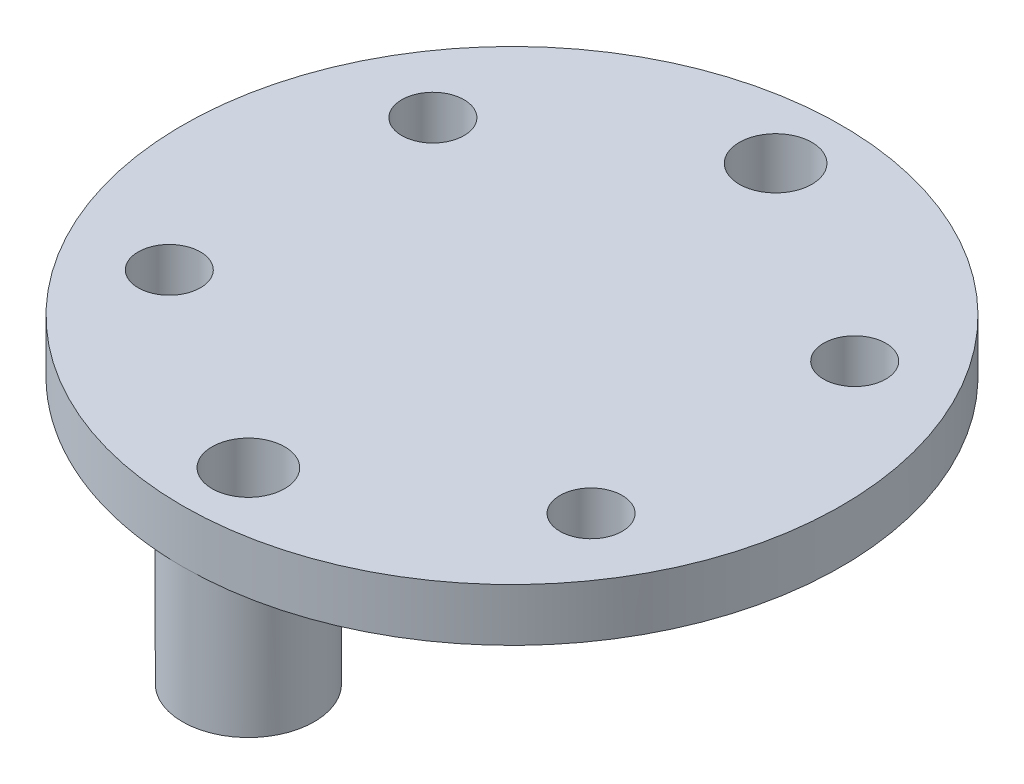
ISO-10303-21;
HEADER;
FILE_DESCRIPTION(('STEP AP214'),'2;1');
FILE_NAME('part.step','',(''),(''),'','','');
FILE_SCHEMA(('AUTOMOTIVE_DESIGN { 1 0 10303 214 1 1 1 1 }'));
ENDSEC;
DATA;
#1=APPLICATION_CONTEXT('core data for automotive mechanical design processes');
#2=APPLICATION_PROTOCOL_DEFINITION('international standard','automotive_design',2000,#1);
#3=PRODUCT_CONTEXT('',#1,'mechanical');
#4=PRODUCT('Part','Part','',(#3));
#5=PRODUCT_RELATED_PRODUCT_CATEGORY('part','',(#4));
#6=PRODUCT_DEFINITION_FORMATION('','',#4);
#7=PRODUCT_DEFINITION_CONTEXT('part definition',#1,'design');
#8=PRODUCT_DEFINITION('design','',#6,#7);
#9=PRODUCT_DEFINITION_SHAPE('','',#8);
#10=(LENGTH_UNIT() NAMED_UNIT(*) SI_UNIT(.MILLI.,.METRE.));
#11=(NAMED_UNIT(*) PLANE_ANGLE_UNIT() SI_UNIT($,.RADIAN.));
#12=(NAMED_UNIT(*) SI_UNIT($,.STERADIAN.) SOLID_ANGLE_UNIT());
#13=UNCERTAINTY_MEASURE_WITH_UNIT(LENGTH_MEASURE(1.E-05),#10,'distance_accuracy_value','');
#14=(GEOMETRIC_REPRESENTATION_CONTEXT(3) GLOBAL_UNCERTAINTY_ASSIGNED_CONTEXT((#13)) GLOBAL_UNIT_ASSIGNED_CONTEXT((#10,
#11,#12)) REPRESENTATION_CONTEXT('',''));
#15=CARTESIAN_POINT('',(0.,0.,0.));
#16=DIRECTION('',(0.,0.,1.));
#17=DIRECTION('',(1.,0.,0.));
#18=AXIS2_PLACEMENT_3D('',#15,#16,#17);
#19=CARTESIAN_POINT('',(0.,2.54,-12.7));
#20=DIRECTION('',(0.,-1.,0.));
#21=DIRECTION('',(0.,0.,-1.));
#22=AXIS2_PLACEMENT_3D('',#19,#20,#21);
#23=CYLINDRICAL_SURFACE('',#22,1.75);
#24=CARTESIAN_POINT('',(0.,2.54,-12.7));
#25=DIRECTION('',(0.,1.,0.));
#26=DIRECTION('',(0.,0.,1.));
#27=AXIS2_PLACEMENT_3D('',#24,#25,#26);
#28=CIRCLE('',#27,1.75);
#29=CARTESIAN_POINT('',(0.,2.54,-10.95));
#30=VERTEX_POINT('',#29);
#31=EDGE_CURVE('E55',#30,#30,#28,.T.);
#32=ORIENTED_EDGE('',*,*,#31,.T.);
#33=EDGE_LOOP('',(#32));
#34=FACE_BOUND('',#33,.T.);
#35=CARTESIAN_POINT('',(0.,-6.47499999892,-12.7));
#36=DIRECTION('',(0.,1.,0.));
#37=DIRECTION('',(0.,0.,1.));
#38=AXIS2_PLACEMENT_3D('',#35,#36,#37);
#39=CIRCLE('',#38,1.75);
#40=CARTESIAN_POINT('',(0.,-6.47499999892,-10.95));
#41=VERTEX_POINT('',#40);
#42=EDGE_CURVE('E179',#41,#41,#39,.T.);
#43=ORIENTED_EDGE('',*,*,#42,.F.);
#44=EDGE_LOOP('',(#43));
#45=FACE_BOUND('',#44,.T.);
#46=ADVANCED_FACE('F43',(#34,#45),#23,.F.);
#47=CARTESIAN_POINT('',(-10.16,2.54,6.35));
#48=DIRECTION('',(0.,-1.,0.));
#49=DIRECTION('',(0.,0.,-1.));
#50=AXIS2_PLACEMENT_3D('',#47,#48,#49);
#51=CYLINDRICAL_SURFACE('',#50,1.5);
#52=CARTESIAN_POINT('',(-10.16,2.54,6.35));
#53=DIRECTION('',(0.,1.,0.));
#54=DIRECTION('',(0.,0.,1.));
#55=AXIS2_PLACEMENT_3D('',#52,#53,#54);
#56=CIRCLE('',#55,1.5);
#57=CARTESIAN_POINT('',(-10.16,2.54,7.85));
#58=VERTEX_POINT('',#57);
#59=EDGE_CURVE('E87',#58,#58,#56,.F.);
#60=ORIENTED_EDGE('',*,*,#59,.F.);
#61=EDGE_LOOP('',(#60));
#62=FACE_BOUND('',#61,.T.);
#63=CARTESIAN_POINT('',(-10.16,0.,6.35));
#64=DIRECTION('',(0.,1.,0.));
#65=DIRECTION('',(0.,0.,1.));
#66=AXIS2_PLACEMENT_3D('',#63,#64,#65);
#67=CIRCLE('',#66,1.5);
#68=CARTESIAN_POINT('',(-10.16,0.,7.85));
#69=VERTEX_POINT('',#68);
#70=EDGE_CURVE('E50',#69,#69,#67,.F.);
#71=ORIENTED_EDGE('',*,*,#70,.T.);
#72=EDGE_LOOP('',(#71));
#73=FACE_BOUND('',#72,.T.);
#74=ADVANCED_FACE('F107',(#62,#73),#51,.F.);
#75=CARTESIAN_POINT('',(10.16,2.54,6.35));
#76=DIRECTION('',(0.,-1.,0.));
#77=DIRECTION('',(0.,0.,-1.));
#78=AXIS2_PLACEMENT_3D('',#75,#76,#77);
#79=CYLINDRICAL_SURFACE('',#78,1.5);
#80=CARTESIAN_POINT('',(10.16,2.54,6.35));
#81=DIRECTION('',(0.,1.,0.));
#82=DIRECTION('',(0.,0.,1.));
#83=AXIS2_PLACEMENT_3D('',#80,#81,#82);
#84=CIRCLE('',#83,1.5);
#85=CARTESIAN_POINT('',(10.16,2.54,7.85));
#86=VERTEX_POINT('',#85);
#87=EDGE_CURVE('E83',#86,#86,#84,.T.);
#88=ORIENTED_EDGE('',*,*,#87,.T.);
#89=EDGE_LOOP('',(#88));
#90=FACE_BOUND('',#89,.T.);
#91=CARTESIAN_POINT('',(10.16,0.,6.35));
#92=DIRECTION('',(0.,1.,0.));
#93=DIRECTION('',(0.,0.,1.));
#94=AXIS2_PLACEMENT_3D('',#91,#92,#93);
#95=CIRCLE('',#94,1.5);
#96=CARTESIAN_POINT('',(10.16,0.,7.85));
#97=VERTEX_POINT('',#96);
#98=EDGE_CURVE('E101',#97,#97,#95,.T.);
#99=ORIENTED_EDGE('',*,*,#98,.F.);
#100=EDGE_LOOP('',(#99));
#101=FACE_BOUND('',#100,.T.);
#102=ADVANCED_FACE('F131',(#90,#101),#79,.F.);
#103=CARTESIAN_POINT('',(-10.16,2.54,-6.35));
#104=DIRECTION('',(0.,-1.,0.));
#105=DIRECTION('',(0.,0.,-1.));
#106=AXIS2_PLACEMENT_3D('',#103,#104,#105);
#107=CYLINDRICAL_SURFACE('',#106,1.5);
#108=CARTESIAN_POINT('',(-10.16,2.54,-6.35));
#109=DIRECTION('',(0.,1.,0.));
#110=DIRECTION('',(0.,0.,1.));
#111=AXIS2_PLACEMENT_3D('',#108,#109,#110);
#112=CIRCLE('',#111,1.5);
#113=CARTESIAN_POINT('',(-10.16,2.54,-4.85));
#114=VERTEX_POINT('',#113);
#115=EDGE_CURVE('E81',#114,#114,#112,.T.);
#116=ORIENTED_EDGE('',*,*,#115,.T.);
#117=EDGE_LOOP('',(#116));
#118=FACE_BOUND('',#117,.T.);
#119=CARTESIAN_POINT('',(-10.16,0.,-6.35));
#120=DIRECTION('',(0.,1.,0.));
#121=DIRECTION('',(0.,0.,1.));
#122=AXIS2_PLACEMENT_3D('',#119,#120,#121);
#123=CIRCLE('',#122,1.5);
#124=CARTESIAN_POINT('',(-10.16,0.,-4.85));
#125=VERTEX_POINT('',#124);
#126=EDGE_CURVE('E97',#125,#125,#123,.T.);
#127=ORIENTED_EDGE('',*,*,#126,.F.);
#128=EDGE_LOOP('',(#127));
#129=FACE_BOUND('',#128,.T.);
#130=ADVANCED_FACE('F143',(#118,#129),#107,.F.);
#131=CARTESIAN_POINT('',(10.16,2.54,-6.35));
#132=DIRECTION('',(0.,-1.,0.));
#133=DIRECTION('',(0.,0.,-1.));
#134=AXIS2_PLACEMENT_3D('',#131,#132,#133);
#135=CYLINDRICAL_SURFACE('',#134,1.5);
#136=CARTESIAN_POINT('',(10.16,2.54,-6.35));
#137=DIRECTION('',(0.,1.,0.));
#138=DIRECTION('',(0.,0.,1.));
#139=AXIS2_PLACEMENT_3D('',#136,#137,#138);
#140=CIRCLE('',#139,1.5);
#141=CARTESIAN_POINT('',(10.16,2.54,-4.85));
#142=VERTEX_POINT('',#141);
#143=EDGE_CURVE('E79',#142,#142,#140,.F.);
#144=ORIENTED_EDGE('',*,*,#143,.F.);
#145=EDGE_LOOP('',(#144));
#146=FACE_BOUND('',#145,.T.);
#147=CARTESIAN_POINT('',(10.16,0.,-6.35));
#148=DIRECTION('',(0.,1.,0.));
#149=DIRECTION('',(0.,0.,1.));
#150=AXIS2_PLACEMENT_3D('',#147,#148,#149);
#151=CIRCLE('',#150,1.5);
#152=CARTESIAN_POINT('',(10.16,0.,-4.85));
#153=VERTEX_POINT('',#152);
#154=EDGE_CURVE('E92',#153,#153,#151,.F.);
#155=ORIENTED_EDGE('',*,*,#154,.T.);
#156=EDGE_LOOP('',(#155));
#157=FACE_BOUND('',#156,.T.);
#158=ADVANCED_FACE('F145',(#146,#157),#135,.F.);
#159=CARTESIAN_POINT('',(0.,2.54,0.));
#160=DIRECTION('',(0.,-1.,0.));
#161=DIRECTION('',(0.,0.,-1.));
#162=AXIS2_PLACEMENT_3D('',#159,#160,#161);
#163=CYLINDRICAL_SURFACE('',#162,15.875);
#164=CARTESIAN_POINT('',(0.,2.54,0.));
#165=DIRECTION('',(0.,1.,0.));
#166=DIRECTION('',(0.,0.,1.));
#167=AXIS2_PLACEMENT_3D('',#164,#165,#166);
#168=CIRCLE('',#167,15.875);
#169=CARTESIAN_POINT('',(0.,2.54,15.875));
#170=VERTEX_POINT('',#169);
#171=EDGE_CURVE('E73',#170,#170,#168,.T.);
#172=ORIENTED_EDGE('',*,*,#171,.F.);
#173=EDGE_LOOP('',(#172));
#174=FACE_BOUND('',#173,.T.);
#175=CARTESIAN_POINT('',(0.,0.,0.));
#176=DIRECTION('',(0.,1.,0.));
#177=DIRECTION('',(0.,0.,1.));
#178=AXIS2_PLACEMENT_3D('',#175,#176,#177);
#179=CIRCLE('',#178,15.875);
#180=CARTESIAN_POINT('',(0.,0.,15.875));
#181=VERTEX_POINT('',#180);
#182=CARTESIAN_POINT('',(0.,0.,-15.875));
#183=VERTEX_POINT('',#182);
#184=EDGE_CURVE('E95',#181,#183,#179,.T.);
#185=ORIENTED_EDGE('',*,*,#184,.T.);
#186=EDGE_CURVE('E96',#183,#181,#179,.T.);
#187=ORIENTED_EDGE('',*,*,#186,.T.);
#188=EDGE_LOOP('',(#185,#187));
#189=FACE_BOUND('',#188,.T.);
#190=ADVANCED_FACE('F44',(#174,#189),#163,.T.);
#191=CARTESIAN_POINT('',(0.,2.54,12.7));
#192=DIRECTION('',(0.,-1.,0.));
#193=DIRECTION('',(0.,0.,-1.));
#194=AXIS2_PLACEMENT_3D('',#191,#192,#193);
#195=CYLINDRICAL_SURFACE('',#194,1.75);
#196=CARTESIAN_POINT('',(0.,2.54,12.7));
#197=DIRECTION('',(0.,1.,0.));
#198=DIRECTION('',(0.,0.,1.));
#199=AXIS2_PLACEMENT_3D('',#196,#197,#198);
#200=CIRCLE('',#199,1.75);
#201=CARTESIAN_POINT('',(0.,2.54,14.45));
#202=VERTEX_POINT('',#201);
#203=EDGE_CURVE('E11',#202,#202,#200,.F.);
#204=ORIENTED_EDGE('',*,*,#203,.F.);
#205=EDGE_LOOP('',(#204));
#206=FACE_BOUND('',#205,.T.);
#207=CARTESIAN_POINT('',(0.,-6.47499999892,12.7));
#208=DIRECTION('',(0.,1.,0.));
#209=DIRECTION('',(0.,0.,1.));
#210=AXIS2_PLACEMENT_3D('',#207,#208,#209);
#211=CIRCLE('',#210,1.75);
#212=CARTESIAN_POINT('',(0.,-6.47499999892,14.45));
#213=VERTEX_POINT('',#212);
#214=EDGE_CURVE('E69',#213,#213,#211,.F.);
#215=ORIENTED_EDGE('',*,*,#214,.T.);
#216=EDGE_LOOP('',(#215));
#217=FACE_BOUND('',#216,.T.);
#218=ADVANCED_FACE('F122',(#206,#217),#195,.F.);
#219=CARTESIAN_POINT('',(0.,2.54,0.));
#220=DIRECTION('',(0.,1.,0.));
#221=DIRECTION('',(0.,0.,1.));
#222=AXIS2_PLACEMENT_3D('',#219,#220,#221);
#223=PLANE('',#222);
#224=ORIENTED_EDGE('',*,*,#171,.T.);
#225=EDGE_LOOP('',(#224));
#226=FACE_BOUND('',#225,.T.);
#227=ORIENTED_EDGE('',*,*,#143,.T.);
#228=EDGE_LOOP('',(#227));
#229=FACE_BOUND('',#228,.T.);
#230=ORIENTED_EDGE('',*,*,#115,.F.);
#231=EDGE_LOOP('',(#230));
#232=FACE_BOUND('',#231,.T.);
#233=ORIENTED_EDGE('',*,*,#87,.F.);
#234=EDGE_LOOP('',(#233));
#235=FACE_BOUND('',#234,.T.);
#236=ORIENTED_EDGE('',*,*,#59,.T.);
#237=EDGE_LOOP('',(#236));
#238=FACE_BOUND('',#237,.T.);
#239=ORIENTED_EDGE('',*,*,#31,.F.);
#240=EDGE_LOOP('',(#239));
#241=FACE_BOUND('',#240,.T.);
#242=ORIENTED_EDGE('',*,*,#203,.T.);
#243=EDGE_LOOP('',(#242));
#244=FACE_BOUND('',#243,.T.);
#245=ADVANCED_FACE('F115',(#226,#229,#232,#235,#238,#241,#244),#223,.T.);
#246=CARTESIAN_POINT('',(0.,0.,0.));
#247=DIRECTION('',(0.,1.,0.));
#248=DIRECTION('',(0.,0.,1.));
#249=AXIS2_PLACEMENT_3D('',#246,#247,#248);
#250=PLANE('',#249);
#251=ORIENTED_EDGE('',*,*,#186,.F.);
#252=CARTESIAN_POINT('',(0.,0.,-12.7));
#253=DIRECTION('',(0.,1.,0.));
#254=DIRECTION('',(0.,0.,1.));
#255=AXIS2_PLACEMENT_3D('',#252,#253,#254);
#256=CIRCLE('',#255,3.175);
#257=EDGE_CURVE('E59',#183,#183,#256,.T.);
#258=ORIENTED_EDGE('',*,*,#257,.T.);
#259=ORIENTED_EDGE('',*,*,#184,.F.);
#260=CARTESIAN_POINT('',(0.,0.,12.7));
#261=DIRECTION('',(0.,1.,0.));
#262=DIRECTION('',(0.,0.,1.));
#263=AXIS2_PLACEMENT_3D('',#260,#261,#262);
#264=CIRCLE('',#263,3.175);
#265=EDGE_CURVE('E65',#181,#181,#264,.T.);
#266=ORIENTED_EDGE('',*,*,#265,.T.);
#267=EDGE_LOOP('',(#251,#258,#259,#266));
#268=FACE_BOUND('',#267,.T.);
#269=ORIENTED_EDGE('',*,*,#154,.F.);
#270=EDGE_LOOP('',(#269));
#271=FACE_BOUND('',#270,.T.);
#272=ORIENTED_EDGE('',*,*,#126,.T.);
#273=EDGE_LOOP('',(#272));
#274=FACE_BOUND('',#273,.T.);
#275=ORIENTED_EDGE('',*,*,#98,.T.);
#276=EDGE_LOOP('',(#275));
#277=FACE_BOUND('',#276,.T.);
#278=ORIENTED_EDGE('',*,*,#70,.F.);
#279=EDGE_LOOP('',(#278));
#280=FACE_BOUND('',#279,.T.);
#281=ADVANCED_FACE('F109',(#268,#271,#274,#277,#280),#250,.F.);
#282=CARTESIAN_POINT('',(0.,-6.47499999892,12.7));
#283=DIRECTION('',(0.,1.,0.));
#284=DIRECTION('',(0.,0.,1.));
#285=AXIS2_PLACEMENT_3D('',#282,#283,#284);
#286=CYLINDRICAL_SURFACE('',#285,3.175);
#287=CARTESIAN_POINT('',(0.,-6.47499999892,12.7));
#288=DIRECTION('',(0.,1.,0.));
#289=DIRECTION('',(0.,0.,1.));
#290=AXIS2_PLACEMENT_3D('',#287,#288,#289);
#291=CIRCLE('',#290,3.175);
#292=CARTESIAN_POINT('',(0.,-6.47499999892,15.875));
#293=VERTEX_POINT('',#292);
#294=EDGE_CURVE('E72',#293,#293,#291,.T.);
#295=ORIENTED_EDGE('',*,*,#294,.T.);
#296=EDGE_LOOP('',(#295));
#297=FACE_BOUND('',#296,.T.);
#298=ORIENTED_EDGE('',*,*,#265,.F.);
#299=EDGE_LOOP('',(#298));
#300=FACE_BOUND('',#299,.T.);
#301=ADVANCED_FACE('F64',(#297,#300),#286,.T.);
#302=CARTESIAN_POINT('',(0.,-6.47499999892,0.));
#303=DIRECTION('',(0.,1.,0.));
#304=DIRECTION('',(0.,0.,1.));
#305=AXIS2_PLACEMENT_3D('',#302,#303,#304);
#306=PLANE('',#305);
#307=ORIENTED_EDGE('',*,*,#214,.F.);
#308=EDGE_LOOP('',(#307));
#309=FACE_BOUND('',#308,.T.);
#310=ORIENTED_EDGE('',*,*,#294,.F.);
#311=EDGE_LOOP('',(#310));
#312=FACE_BOUND('',#311,.T.);
#313=ADVANCED_FACE('F119',(#309,#312),#306,.F.);
#314=CARTESIAN_POINT('',(0.,-6.47499999892,-12.7));
#315=DIRECTION('',(0.,1.,0.));
#316=DIRECTION('',(0.,0.,1.));
#317=AXIS2_PLACEMENT_3D('',#314,#315,#316);
#318=CYLINDRICAL_SURFACE('',#317,3.175);
#319=CARTESIAN_POINT('',(0.,-6.47499999892,-12.7));
#320=DIRECTION('',(0.,1.,0.));
#321=DIRECTION('',(0.,0.,1.));
#322=AXIS2_PLACEMENT_3D('',#319,#320,#321);
#323=CIRCLE('',#322,3.175);
#324=CARTESIAN_POINT('',(0.,-6.47499999892,-9.525));
#325=VERTEX_POINT('',#324);
#326=EDGE_CURVE('E182',#325,#325,#323,.T.);
#327=ORIENTED_EDGE('',*,*,#326,.T.);
#328=EDGE_LOOP('',(#327));
#329=FACE_BOUND('',#328,.T.);
#330=ORIENTED_EDGE('',*,*,#257,.F.);
#331=EDGE_LOOP('',(#330));
#332=FACE_BOUND('',#331,.T.);
#333=ADVANCED_FACE('F171',(#329,#332),#318,.T.);
#334=CARTESIAN_POINT('',(0.,-6.47499999892,0.));
#335=DIRECTION('',(0.,1.,0.));
#336=DIRECTION('',(0.,0.,1.));
#337=AXIS2_PLACEMENT_3D('',#334,#335,#336);
#338=PLANE('',#337);
#339=ORIENTED_EDGE('',*,*,#42,.T.);
#340=EDGE_LOOP('',(#339));
#341=FACE_BOUND('',#340,.T.);
#342=ORIENTED_EDGE('',*,*,#326,.F.);
#343=EDGE_LOOP('',(#342));
#344=FACE_BOUND('',#343,.T.);
#345=ADVANCED_FACE('F186',(#341,#344),#338,.F.);
#346=CLOSED_SHELL('',(#46,#74,#102,#130,#158,#190,#218,#245,#281,#301,#313,#333,#345));
#347=MANIFOLD_SOLID_BREP('B2',#346);
#348=ADVANCED_BREP_SHAPE_REPRESENTATION('',(#18,#347),#14);
#349=SHAPE_DEFINITION_REPRESENTATION(#9,#348);
ENDSEC;
END-ISO-10303-21;
